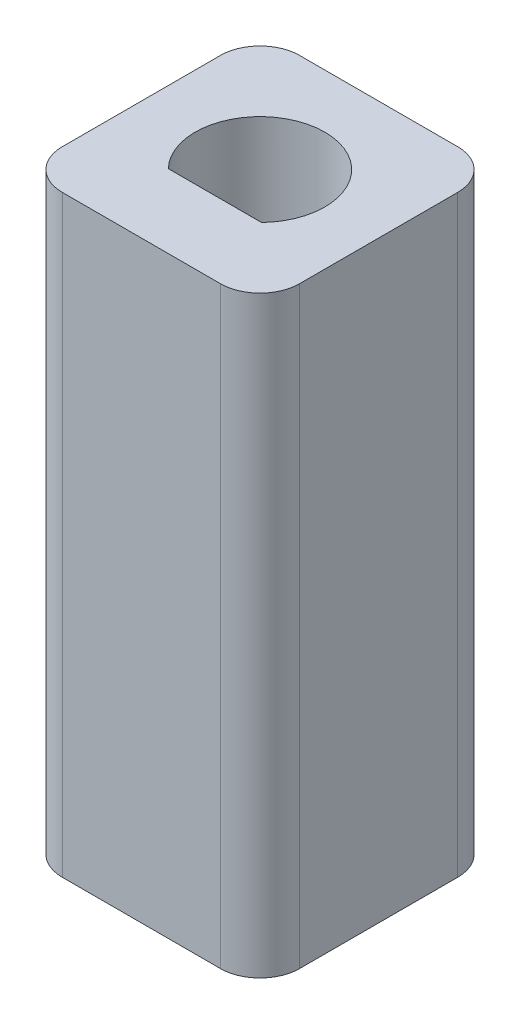
ISO-10303-21;
HEADER;
FILE_DESCRIPTION(('STEP AP214'),'2;1');
FILE_NAME('part.step','',(''),(''),'','','');
FILE_SCHEMA(('AUTOMOTIVE_DESIGN { 1 0 10303 214 1 1 1 1 }'));
ENDSEC;
DATA;
#1=APPLICATION_CONTEXT('core data for automotive mechanical design processes');
#2=APPLICATION_PROTOCOL_DEFINITION('international standard','automotive_design',2000,#1);
#3=PRODUCT_CONTEXT('',#1,'mechanical');
#4=PRODUCT('Part','Part','',(#3));
#5=PRODUCT_RELATED_PRODUCT_CATEGORY('part','',(#4));
#6=PRODUCT_DEFINITION_FORMATION('','',#4);
#7=PRODUCT_DEFINITION_CONTEXT('part definition',#1,'design');
#8=PRODUCT_DEFINITION('design','',#6,#7);
#9=PRODUCT_DEFINITION_SHAPE('','',#8);
#10=(LENGTH_UNIT() NAMED_UNIT(*) SI_UNIT(.MILLI.,.METRE.));
#11=(NAMED_UNIT(*) PLANE_ANGLE_UNIT() SI_UNIT($,.RADIAN.));
#12=(NAMED_UNIT(*) SI_UNIT($,.STERADIAN.) SOLID_ANGLE_UNIT());
#13=UNCERTAINTY_MEASURE_WITH_UNIT(LENGTH_MEASURE(1.E-05),#10,'distance_accuracy_value','');
#14=(GEOMETRIC_REPRESENTATION_CONTEXT(3) GLOBAL_UNCERTAINTY_ASSIGNED_CONTEXT((#13)) GLOBAL_UNIT_ASSIGNED_CONTEXT((#10,
#11,#12)) REPRESENTATION_CONTEXT('',''));
#15=CARTESIAN_POINT('',(0.,0.,0.));
#16=DIRECTION('',(0.,0.,1.));
#17=DIRECTION('',(1.,0.,0.));
#18=AXIS2_PLACEMENT_3D('',#15,#16,#17);
#19=CARTESIAN_POINT('',(0.,0.,0.));
#20=DIRECTION('',(0.,1.,0.));
#21=DIRECTION('',(0.,0.,1.));
#22=AXIS2_PLACEMENT_3D('',#19,#20,#21);
#23=PLANE('',#22);
#24=DIRECTION('',(1.,0.,0.));
#25=VECTOR('',#24,1.);
#26=CARTESIAN_POINT('',(-1.17898261225517,0.,1.14));
#27=LINE('',#26,#25);
#28=CARTESIAN_POINT('',(-1.03129837751131,0.,1.14));
#29=VERTEX_POINT('',#28);
#30=CARTESIAN_POINT('',(1.03129837751131,0.,1.14));
#31=VERTEX_POINT('',#30);
#32=EDGE_CURVE('E400',#29,#31,#27,.T.);
#33=ORIENTED_EDGE('',*,*,#32,.T.);
#34=CARTESIAN_POINT('',(1.435,0.,1.435));
#35=DIRECTION('',(0.,1.,0.));
#36=DIRECTION('',(0.,0.,-1.));
#37=AXIS2_PLACEMENT_3D('',#34,#35,#36);
#38=CIRCLE('',#37,0.5);
#39=CARTESIAN_POINT('',(0.935000000000001,0.,1.435));
#40=VERTEX_POINT('',#39);
#41=EDGE_CURVE('E299',#31,#40,#38,.T.);
#42=ORIENTED_EDGE('',*,*,#41,.T.);
#43=DIRECTION('',(0.,0.,1.));
#44=VECTOR('',#43,1.);
#45=CARTESIAN_POINT('',(0.935000000000001,0.,1.435));
#46=LINE('',#45,#44);
#47=CARTESIAN_POINT('',(0.935000000000001,0.,2.35));
#48=VERTEX_POINT('',#47);
#49=EDGE_CURVE('E257',#40,#48,#46,.T.);
#50=ORIENTED_EDGE('',*,*,#49,.T.);
#51=CARTESIAN_POINT('',(0.,0.,0.));
#52=DIRECTION('',(0.,-1.,0.));
#53=DIRECTION('',(0.,0.,-1.));
#54=AXIS2_PLACEMENT_3D('',#51,#52,#53);
#55=CIRCLE('',#54,2.52917476659878);
#56=CARTESIAN_POINT('',(-0.934999999999999,0.,2.35));
#57=VERTEX_POINT('',#56);
#58=EDGE_CURVE('E301',#48,#57,#55,.T.);
#59=ORIENTED_EDGE('',*,*,#58,.T.);
#60=DIRECTION('',(0.,0.,-1.));
#61=VECTOR('',#60,1.);
#62=CARTESIAN_POINT('',(-0.935,0.,2.35));
#63=LINE('',#62,#61);
#64=CARTESIAN_POINT('',(-0.935,0.,1.435));
#65=VERTEX_POINT('',#64);
#66=EDGE_CURVE('E304',#57,#65,#63,.T.);
#67=ORIENTED_EDGE('',*,*,#66,.T.);
#68=CARTESIAN_POINT('',(-1.435,0.,1.435));
#69=DIRECTION('',(0.,1.,0.));
#70=DIRECTION('',(0.,0.,-1.));
#71=AXIS2_PLACEMENT_3D('',#68,#69,#70);
#72=CIRCLE('',#71,0.5);
#73=EDGE_CURVE('E308',#65,#29,#72,.T.);
#74=ORIENTED_EDGE('',*,*,#73,.T.);
#75=EDGE_LOOP('',(#33,#42,#50,#59,#67,#74));
#76=FACE_BOUND('',#75,.T.);
#77=ADVANCED_FACE('F41',(#76),#23,.F.);
#78=CARTESIAN_POINT('',(0.,0.,0.));
#79=DIRECTION('',(0.,1.,0.));
#80=DIRECTION('',(0.,0.,1.));
#81=AXIS2_PLACEMENT_3D('',#78,#79,#80);
#82=CIRCLE('',#81,1.64000000000002);
#83=CARTESIAN_POINT('',(-1.34114758379907,0.,-0.943887259406512));
#84=VERTEX_POINT('',#83);
#85=CARTESIAN_POINT('',(-1.34114758379907,0.,0.943887259406512));
#86=VERTEX_POINT('',#85);
#87=EDGE_CURVE('E517',#84,#86,#82,.T.);
#88=ORIENTED_EDGE('',*,*,#87,.T.);
#89=CARTESIAN_POINT('',(-1.435,0.,0.935));
#90=VERTEX_POINT('',#89);
#91=EDGE_CURVE('E312',#86,#90,#72,.T.);
#92=ORIENTED_EDGE('',*,*,#91,.T.);
#93=DIRECTION('',(-1.,0.,0.));
#94=VECTOR('',#93,1.);
#95=CARTESIAN_POINT('',(-1.435,0.,0.935));
#96=LINE('',#95,#94);
#97=CARTESIAN_POINT('',(-2.35,0.,0.934999999999999));
#98=VERTEX_POINT('',#97);
#99=EDGE_CURVE('E311',#90,#98,#96,.T.);
#100=ORIENTED_EDGE('',*,*,#99,.T.);
#101=CARTESIAN_POINT('',(0.,0.,0.));
#102=DIRECTION('',(0.,-1.,0.));
#103=DIRECTION('',(0.,0.,-1.));
#104=AXIS2_PLACEMENT_3D('',#101,#102,#103);
#105=CIRCLE('',#104,2.52917476659878);
#106=CARTESIAN_POINT('',(-2.35,0.,-0.935));
#107=VERTEX_POINT('',#106);
#108=EDGE_CURVE('E315',#98,#107,#105,.T.);
#109=ORIENTED_EDGE('',*,*,#108,.T.);
#110=DIRECTION('',(1.,0.,0.));
#111=VECTOR('',#110,1.);
#112=CARTESIAN_POINT('',(-2.35,0.,-0.935));
#113=LINE('',#112,#111);
#114=CARTESIAN_POINT('',(-1.435,0.,-0.935));
#115=VERTEX_POINT('',#114);
#116=EDGE_CURVE('E318',#107,#115,#113,.T.);
#117=ORIENTED_EDGE('',*,*,#116,.T.);
#118=CARTESIAN_POINT('',(-1.435,0.,-1.435));
#119=DIRECTION('',(0.,1.,0.));
#120=DIRECTION('',(0.,0.,-1.));
#121=AXIS2_PLACEMENT_3D('',#118,#119,#120);
#122=CIRCLE('',#121,0.5);
#123=EDGE_CURVE('E322',#115,#84,#122,.T.);
#124=ORIENTED_EDGE('',*,*,#123,.T.);
#125=EDGE_LOOP('',(#88,#92,#100,#109,#117,#124));
#126=FACE_BOUND('',#125,.T.);
#127=ADVANCED_FACE('F483',(#126),#23,.F.);
#128=CARTESIAN_POINT('',(0.943887259406503,0.,-1.34114758379912));
#129=VERTEX_POINT('',#128);
#130=CARTESIAN_POINT('',(-0.943887259406511,0.,-1.34114758379908));
#131=VERTEX_POINT('',#130);
#132=EDGE_CURVE('E510',#129,#131,#82,.T.);
#133=ORIENTED_EDGE('',*,*,#132,.T.);
#134=CARTESIAN_POINT('',(-0.935000000000001,0.,-1.435));
#135=VERTEX_POINT('',#134);
#136=EDGE_CURVE('E326',#131,#135,#122,.T.);
#137=ORIENTED_EDGE('',*,*,#136,.T.);
#138=DIRECTION('',(0.,0.,-1.));
#139=VECTOR('',#138,1.);
#140=CARTESIAN_POINT('',(-0.935000000000001,0.,-1.435));
#141=LINE('',#140,#139);
#142=CARTESIAN_POINT('',(-0.935,0.,-2.35));
#143=VERTEX_POINT('',#142);
#144=EDGE_CURVE('E325',#135,#143,#141,.T.);
#145=ORIENTED_EDGE('',*,*,#144,.T.);
#146=CARTESIAN_POINT('',(0.,0.,0.));
#147=DIRECTION('',(0.,-1.,0.));
#148=DIRECTION('',(0.,0.,-1.));
#149=AXIS2_PLACEMENT_3D('',#146,#147,#148);
#150=CIRCLE('',#149,2.52917476659878);
#151=CARTESIAN_POINT('',(0.935000000000001,0.,-2.35));
#152=VERTEX_POINT('',#151);
#153=EDGE_CURVE('E329',#143,#152,#150,.T.);
#154=ORIENTED_EDGE('',*,*,#153,.T.);
#155=DIRECTION('',(0.,0.,1.));
#156=VECTOR('',#155,1.);
#157=CARTESIAN_POINT('',(0.935000000000001,0.,-2.35));
#158=LINE('',#157,#156);
#159=CARTESIAN_POINT('',(0.935000000000001,0.,-1.435));
#160=VERTEX_POINT('',#159);
#161=EDGE_CURVE('E332',#152,#160,#158,.T.);
#162=ORIENTED_EDGE('',*,*,#161,.T.);
#163=CARTESIAN_POINT('',(1.435,0.,-1.435));
#164=DIRECTION('',(0.,1.,0.));
#165=DIRECTION('',(0.,0.,-1.));
#166=AXIS2_PLACEMENT_3D('',#163,#164,#165);
#167=CIRCLE('',#166,0.5);
#168=EDGE_CURVE('E336',#160,#129,#167,.T.);
#169=ORIENTED_EDGE('',*,*,#168,.T.);
#170=EDGE_LOOP('',(#133,#137,#145,#154,#162,#169));
#171=FACE_BOUND('',#170,.T.);
#172=ADVANCED_FACE('F490',(#171),#23,.F.);
#173=CARTESIAN_POINT('',(0.,8.,0.));
#174=DIRECTION('',(0.,1.,0.));
#175=DIRECTION('',(0.,0.,1.));
#176=AXIS2_PLACEMENT_3D('',#173,#174,#175);
#177=PLANE('',#176);
#178=DIRECTION('',(1.,0.,0.));
#179=VECTOR('',#178,1.);
#180=CARTESIAN_POINT('',(-3.,8.,3.));
#181=LINE('',#180,#179);
#182=CARTESIAN_POINT('',(-2.,8.,3.));
#183=VERTEX_POINT('',#182);
#184=CARTESIAN_POINT('',(2.,8.,3.));
#185=VERTEX_POINT('',#184);
#186=EDGE_CURVE('E413',#183,#185,#181,.T.);
#187=ORIENTED_EDGE('',*,*,#186,.T.);
#188=CARTESIAN_POINT('',(2.,8.,2.));
#189=DIRECTION('',(0.,1.,0.));
#190=DIRECTION('',(0.,0.,1.));
#191=AXIS2_PLACEMENT_3D('',#188,#189,#190);
#192=CIRCLE('',#191,1.);
#193=CARTESIAN_POINT('',(3.,8.,2.));
#194=VERTEX_POINT('',#193);
#195=EDGE_CURVE('E439',#185,#194,#192,.T.);
#196=ORIENTED_EDGE('',*,*,#195,.T.);
#197=DIRECTION('',(0.,0.,-1.));
#198=VECTOR('',#197,1.);
#199=CARTESIAN_POINT('',(3.,8.,-3.));
#200=LINE('',#199,#198);
#201=CARTESIAN_POINT('',(3.,8.,-2.));
#202=VERTEX_POINT('',#201);
#203=EDGE_CURVE('E406',#194,#202,#200,.T.);
#204=ORIENTED_EDGE('',*,*,#203,.T.);
#205=CARTESIAN_POINT('',(2.,8.,-2.));
#206=DIRECTION('',(0.,1.,0.));
#207=DIRECTION('',(0.,0.,1.));
#208=AXIS2_PLACEMENT_3D('',#205,#206,#207);
#209=CIRCLE('',#208,1.);
#210=CARTESIAN_POINT('',(2.,8.,-3.));
#211=VERTEX_POINT('',#210);
#212=EDGE_CURVE('E434',#202,#211,#209,.T.);
#213=ORIENTED_EDGE('',*,*,#212,.T.);
#214=DIRECTION('',(-1.,0.,0.));
#215=VECTOR('',#214,1.);
#216=CARTESIAN_POINT('',(-3.,8.,-3.));
#217=LINE('',#216,#215);
#218=CARTESIAN_POINT('',(-2.,8.,-3.));
#219=VERTEX_POINT('',#218);
#220=EDGE_CURVE('E409',#211,#219,#217,.T.);
#221=ORIENTED_EDGE('',*,*,#220,.T.);
#222=CARTESIAN_POINT('',(-2.,8.,-2.));
#223=DIRECTION('',(0.,1.,0.));
#224=DIRECTION('',(0.,0.,1.));
#225=AXIS2_PLACEMENT_3D('',#222,#223,#224);
#226=CIRCLE('',#225,1.);
#227=CARTESIAN_POINT('',(-3.,8.,-2.));
#228=VERTEX_POINT('',#227);
#229=EDGE_CURVE('E63',#219,#228,#226,.T.);
#230=ORIENTED_EDGE('',*,*,#229,.T.);
#231=DIRECTION('',(0.,0.,1.));
#232=VECTOR('',#231,1.);
#233=CARTESIAN_POINT('',(-3.,8.,-3.));
#234=LINE('',#233,#232);
#235=CARTESIAN_POINT('',(-3.,8.,2.));
#236=VERTEX_POINT('',#235);
#237=EDGE_CURVE('E411',#228,#236,#234,.T.);
#238=ORIENTED_EDGE('',*,*,#237,.T.);
#239=CARTESIAN_POINT('',(-2.,8.,2.));
#240=DIRECTION('',(0.,1.,0.));
#241=DIRECTION('',(0.,0.,1.));
#242=AXIS2_PLACEMENT_3D('',#239,#240,#241);
#243=CIRCLE('',#242,1.);
#244=EDGE_CURVE('E437',#236,#183,#243,.T.);
#245=ORIENTED_EDGE('',*,*,#244,.T.);
#246=EDGE_LOOP('',(#187,#196,#204,#213,#221,#230,#238,#245));
#247=FACE_BOUND('',#246,.T.);
#248=DIRECTION('',(1.,0.,0.));
#249=VECTOR('',#248,1.);
#250=CARTESIAN_POINT('',(-1.17898261225517,8.,1.14));
#251=LINE('',#250,#249);
#252=CARTESIAN_POINT('',(-1.17898261225517,8.,1.14));
#253=VERTEX_POINT('',#252);
#254=CARTESIAN_POINT('',(1.17898261225522,8.,1.14));
#255=VERTEX_POINT('',#254);
#256=EDGE_CURVE('E391',#253,#255,#251,.T.);
#257=ORIENTED_EDGE('',*,*,#256,.F.);
#258=CARTESIAN_POINT('',(0.,8.,0.));
#259=DIRECTION('',(0.,1.,0.));
#260=DIRECTION('',(0.,0.,1.));
#261=AXIS2_PLACEMENT_3D('',#258,#259,#260);
#262=CIRCLE('',#261,1.64000000000002);
#263=EDGE_CURVE('E388',#255,#253,#262,.T.);
#264=ORIENTED_EDGE('',*,*,#263,.F.);
#265=EDGE_LOOP('',(#257,#264));
#266=FACE_BOUND('',#265,.T.);
#267=ADVANCED_FACE('F460',(#247,#266),#177,.T.);
#268=DIRECTION('',(-1.,0.,0.));
#269=VECTOR('',#268,1.);
#270=CARTESIAN_POINT('',(2.35,0.,0.935));
#271=LINE('',#270,#269);
#272=CARTESIAN_POINT('',(2.35,0.,0.935));
#273=VERTEX_POINT('',#272);
#274=CARTESIAN_POINT('',(1.435,0.,0.935));
#275=VERTEX_POINT('',#274);
#276=EDGE_CURVE('E251',#273,#275,#271,.T.);
#277=ORIENTED_EDGE('',*,*,#276,.T.);
#278=CARTESIAN_POINT('',(1.34114758379912,0.,0.943887259406501));
#279=VERTEX_POINT('',#278);
#280=EDGE_CURVE('E295',#275,#279,#38,.T.);
#281=ORIENTED_EDGE('',*,*,#280,.T.);
#282=CARTESIAN_POINT('',(1.34114758379912,0.,-0.943887259406501));
#283=VERTEX_POINT('',#282);
#284=EDGE_CURVE('E398',#279,#283,#82,.T.);
#285=ORIENTED_EDGE('',*,*,#284,.T.);
#286=CARTESIAN_POINT('',(1.435,0.,-0.935));
#287=VERTEX_POINT('',#286);
#288=EDGE_CURVE('E340',#283,#287,#167,.T.);
#289=ORIENTED_EDGE('',*,*,#288,.T.);
#290=DIRECTION('',(1.,0.,0.));
#291=VECTOR('',#290,1.);
#292=CARTESIAN_POINT('',(1.435,0.,-0.935));
#293=LINE('',#292,#291);
#294=CARTESIAN_POINT('',(2.35,0.,-0.935000000000001));
#295=VERTEX_POINT('',#294);
#296=EDGE_CURVE('E339',#287,#295,#293,.T.);
#297=ORIENTED_EDGE('',*,*,#296,.T.);
#298=CARTESIAN_POINT('',(0.,0.,0.));
#299=DIRECTION('',(0.,-1.,0.));
#300=DIRECTION('',(0.,0.,-1.));
#301=AXIS2_PLACEMENT_3D('',#298,#299,#300);
#302=CIRCLE('',#301,2.52917476659878);
#303=EDGE_CURVE('E343',#295,#273,#302,.T.);
#304=ORIENTED_EDGE('',*,*,#303,.T.);
#305=EDGE_LOOP('',(#277,#281,#285,#289,#297,#304));
#306=FACE_BOUND('',#305,.T.);
#307=ADVANCED_FACE('F486',(#306),#23,.F.);
#308=CARTESIAN_POINT('',(3.,8.,-3.));
#309=DIRECTION('',(-1.,0.,0.));
#310=DIRECTION('',(0.,0.,1.));
#311=AXIS2_PLACEMENT_3D('',#308,#309,#310);
#312=PLANE('',#311);
#313=ORIENTED_EDGE('',*,*,#203,.F.);
#314=DIRECTION('',(0.,-1.,0.));
#315=VECTOR('',#314,1.);
#316=CARTESIAN_POINT('',(3.,8.,2.));
#317=LINE('',#316,#315);
#318=CARTESIAN_POINT('',(3.,-7.,2.));
#319=VERTEX_POINT('',#318);
#320=EDGE_CURVE('E418',#194,#319,#317,.T.);
#321=ORIENTED_EDGE('',*,*,#320,.T.);
#322=DIRECTION('',(0.,0.,1.));
#323=VECTOR('',#322,1.);
#324=CARTESIAN_POINT('',(3.,-7.,-3.));
#325=LINE('',#324,#323);
#326=CARTESIAN_POINT('',(3.,-7.,-2.));
#327=VERTEX_POINT('',#326);
#328=EDGE_CURVE('E381',#327,#319,#325,.T.);
#329=ORIENTED_EDGE('',*,*,#328,.F.);
#330=DIRECTION('',(0.,-1.,0.));
#331=VECTOR('',#330,1.);
#332=CARTESIAN_POINT('',(3.,8.,-2.));
#333=LINE('',#332,#331);
#334=EDGE_CURVE('E416',#327,#202,#333,.F.);
#335=ORIENTED_EDGE('',*,*,#334,.T.);
#336=EDGE_LOOP('',(#313,#321,#329,#335));
#337=FACE_BOUND('',#336,.T.);
#338=ADVANCED_FACE('F476',(#337),#312,.F.);
#339=CARTESIAN_POINT('',(-3.,8.,-3.));
#340=DIRECTION('',(0.,0.,1.));
#341=DIRECTION('',(1.,0.,0.));
#342=AXIS2_PLACEMENT_3D('',#339,#340,#341);
#343=PLANE('',#342);
#344=DIRECTION('',(1.,0.,0.));
#345=VECTOR('',#344,1.);
#346=CARTESIAN_POINT('',(3.,-7.,-3.));
#347=LINE('',#346,#345);
#348=CARTESIAN_POINT('',(-2.,-7.,-3.));
#349=VERTEX_POINT('',#348);
#350=CARTESIAN_POINT('',(2.,-7.,-3.));
#351=VERTEX_POINT('',#350);
#352=EDGE_CURVE('E378',#349,#351,#347,.T.);
#353=ORIENTED_EDGE('',*,*,#352,.F.);
#354=DIRECTION('',(0.,-1.,0.));
#355=VECTOR('',#354,1.);
#356=CARTESIAN_POINT('',(-2.,8.,-3.));
#357=LINE('',#356,#355);
#358=EDGE_CURVE('E11',#349,#219,#357,.F.);
#359=ORIENTED_EDGE('',*,*,#358,.T.);
#360=ORIENTED_EDGE('',*,*,#220,.F.);
#361=DIRECTION('',(0.,-1.,0.));
#362=VECTOR('',#361,1.);
#363=CARTESIAN_POINT('',(2.,8.,-3.));
#364=LINE('',#363,#362);
#365=EDGE_CURVE('E49',#211,#351,#364,.T.);
#366=ORIENTED_EDGE('',*,*,#365,.T.);
#367=EDGE_LOOP('',(#353,#359,#360,#366));
#368=FACE_BOUND('',#367,.T.);
#369=ADVANCED_FACE('F449',(#368),#343,.F.);
#370=CARTESIAN_POINT('',(-3.,8.,-3.));
#371=DIRECTION('',(1.,0.,0.));
#372=DIRECTION('',(0.,0.,-1.));
#373=AXIS2_PLACEMENT_3D('',#370,#371,#372);
#374=PLANE('',#373);
#375=DIRECTION('',(0.,0.,-1.));
#376=VECTOR('',#375,1.);
#377=CARTESIAN_POINT('',(-3.,-7.,-3.));
#378=LINE('',#377,#376);
#379=CARTESIAN_POINT('',(-3.,-7.,2.));
#380=VERTEX_POINT('',#379);
#381=CARTESIAN_POINT('',(-3.,-7.,-2.));
#382=VERTEX_POINT('',#381);
#383=EDGE_CURVE('E258',#380,#382,#378,.T.);
#384=ORIENTED_EDGE('',*,*,#383,.F.);
#385=DIRECTION('',(0.,-1.,0.));
#386=VECTOR('',#385,1.);
#387=CARTESIAN_POINT('',(-3.,8.,2.));
#388=LINE('',#387,#386);
#389=EDGE_CURVE('E56',#380,#236,#388,.F.);
#390=ORIENTED_EDGE('',*,*,#389,.T.);
#391=ORIENTED_EDGE('',*,*,#237,.F.);
#392=DIRECTION('',(0.,-1.,0.));
#393=VECTOR('',#392,1.);
#394=CARTESIAN_POINT('',(-3.,8.,-2.));
#395=LINE('',#394,#393);
#396=EDGE_CURVE('E441',#228,#382,#395,.T.);
#397=ORIENTED_EDGE('',*,*,#396,.T.);
#398=EDGE_LOOP('',(#384,#390,#391,#397));
#399=FACE_BOUND('',#398,.T.);
#400=ADVANCED_FACE('F458',(#399),#374,.F.);
#401=CARTESIAN_POINT('',(-3.,8.,3.));
#402=DIRECTION('',(0.,0.,-1.));
#403=DIRECTION('',(-1.,0.,0.));
#404=AXIS2_PLACEMENT_3D('',#401,#402,#403);
#405=PLANE('',#404);
#406=DIRECTION('',(-1.,0.,0.));
#407=VECTOR('',#406,1.);
#408=CARTESIAN_POINT('',(3.,-7.,3.));
#409=LINE('',#408,#407);
#410=CARTESIAN_POINT('',(2.,-7.,3.));
#411=VERTEX_POINT('',#410);
#412=CARTESIAN_POINT('',(-2.,-7.,3.));
#413=VERTEX_POINT('',#412);
#414=EDGE_CURVE('E384',#411,#413,#409,.T.);
#415=ORIENTED_EDGE('',*,*,#414,.F.);
#416=DIRECTION('',(0.,-1.,0.));
#417=VECTOR('',#416,1.);
#418=CARTESIAN_POINT('',(2.,8.,3.));
#419=LINE('',#418,#417);
#420=EDGE_CURVE('E432',#411,#185,#419,.F.);
#421=ORIENTED_EDGE('',*,*,#420,.T.);
#422=ORIENTED_EDGE('',*,*,#186,.F.);
#423=DIRECTION('',(0.,-1.,0.));
#424=VECTOR('',#423,1.);
#425=CARTESIAN_POINT('',(-2.,8.,3.));
#426=LINE('',#425,#424);
#427=EDGE_CURVE('E429',#183,#413,#426,.T.);
#428=ORIENTED_EDGE('',*,*,#427,.T.);
#429=EDGE_LOOP('',(#415,#421,#422,#428));
#430=FACE_BOUND('',#429,.T.);
#431=ADVANCED_FACE('F468',(#430),#405,.F.);
#432=CARTESIAN_POINT('',(0.,8.,0.));
#433=DIRECTION('',(0.,-1.,0.));
#434=DIRECTION('',(0.,0.,-1.));
#435=AXIS2_PLACEMENT_3D('',#432,#433,#434);
#436=CYLINDRICAL_SURFACE('',#435,1.64000000000002);
#437=CARTESIAN_POINT('',(1.17898261225522,0.,1.14));
#438=VERTEX_POINT('',#437);
#439=EDGE_CURVE('E395',#438,#279,#82,.T.);
#440=ORIENTED_EDGE('',*,*,#439,.F.);
#441=DIRECTION('',(0.,-1.,0.));
#442=VECTOR('',#441,1.);
#443=CARTESIAN_POINT('',(1.17898261225522,8.,1.14));
#444=LINE('',#443,#442);
#445=EDGE_CURVE('E394',#255,#438,#444,.T.);
#446=ORIENTED_EDGE('',*,*,#445,.F.);
#447=ORIENTED_EDGE('',*,*,#263,.T.);
#448=DIRECTION('',(0.,-1.,0.));
#449=VECTOR('',#448,1.);
#450=CARTESIAN_POINT('',(-1.17898261225517,8.,1.14));
#451=LINE('',#450,#449);
#452=CARTESIAN_POINT('',(-1.17898261225517,0.,1.14));
#453=VERTEX_POINT('',#452);
#454=EDGE_CURVE('E403',#253,#453,#451,.T.);
#455=ORIENTED_EDGE('',*,*,#454,.T.);
#456=EDGE_CURVE('E387',#86,#453,#82,.T.);
#457=ORIENTED_EDGE('',*,*,#456,.F.);
#458=ORIENTED_EDGE('',*,*,#87,.F.);
#459=EDGE_CURVE('E516',#131,#84,#82,.T.);
#460=ORIENTED_EDGE('',*,*,#459,.F.);
#461=ORIENTED_EDGE('',*,*,#132,.F.);
#462=EDGE_CURVE('E515',#283,#129,#82,.T.);
#463=ORIENTED_EDGE('',*,*,#462,.F.);
#464=ORIENTED_EDGE('',*,*,#284,.F.);
#465=EDGE_LOOP('',(#440,#446,#447,#455,#457,#458,#460,#461,#463,#464));
#466=FACE_BOUND('',#465,.T.);
#467=ADVANCED_FACE('F535',(#466),#436,.F.);
#468=CARTESIAN_POINT('',(-1.17898261225517,8.,1.14));
#469=DIRECTION('',(0.,0.,-1.));
#470=DIRECTION('',(-1.,0.,0.));
#471=AXIS2_PLACEMENT_3D('',#468,#469,#470);
#472=PLANE('',#471);
#473=EDGE_CURVE('E392',#453,#29,#27,.T.);
#474=ORIENTED_EDGE('',*,*,#473,.F.);
#475=ORIENTED_EDGE('',*,*,#454,.F.);
#476=ORIENTED_EDGE('',*,*,#256,.T.);
#477=ORIENTED_EDGE('',*,*,#445,.T.);
#478=EDGE_CURVE('E397',#31,#438,#27,.T.);
#479=ORIENTED_EDGE('',*,*,#478,.F.);
#480=ORIENTED_EDGE('',*,*,#32,.F.);
#481=EDGE_LOOP('',(#474,#475,#476,#477,#479,#480));
#482=FACE_BOUND('',#481,.T.);
#483=ADVANCED_FACE('F532',(#482),#472,.T.);
#484=CARTESIAN_POINT('',(0.,0.,0.));
#485=DIRECTION('',(0.,-1.,0.));
#486=DIRECTION('',(0.,0.,-1.));
#487=AXIS2_PLACEMENT_3D('',#484,#485,#486);
#488=PLANE('',#487);
#489=EDGE_CURVE('E335',#129,#283,#167,.T.);
#490=ORIENTED_EDGE('',*,*,#489,.T.);
#491=ORIENTED_EDGE('',*,*,#462,.T.);
#492=EDGE_LOOP('',(#490,#491));
#493=FACE_BOUND('',#492,.T.);
#494=ADVANCED_FACE('F583',(#493),#488,.F.);
#495=EDGE_CURVE('E321',#84,#131,#122,.T.);
#496=ORIENTED_EDGE('',*,*,#495,.T.);
#497=ORIENTED_EDGE('',*,*,#459,.T.);
#498=EDGE_LOOP('',(#496,#497));
#499=FACE_BOUND('',#498,.T.);
#500=ADVANCED_FACE('F548',(#499),#488,.F.);
#501=EDGE_CURVE('E307',#29,#86,#72,.T.);
#502=ORIENTED_EDGE('',*,*,#501,.T.);
#503=ORIENTED_EDGE('',*,*,#456,.T.);
#504=ORIENTED_EDGE('',*,*,#473,.T.);
#505=EDGE_LOOP('',(#502,#503,#504));
#506=FACE_BOUND('',#505,.T.);
#507=ADVANCED_FACE('F528',(#506),#488,.F.);
#508=ORIENTED_EDGE('',*,*,#478,.T.);
#509=ORIENTED_EDGE('',*,*,#439,.T.);
#510=EDGE_CURVE('E298',#279,#31,#38,.T.);
#511=ORIENTED_EDGE('',*,*,#510,.T.);
#512=EDGE_LOOP('',(#508,#509,#511));
#513=FACE_BOUND('',#512,.T.);
#514=ADVANCED_FACE('F588',(#513),#488,.F.);
#515=CARTESIAN_POINT('',(0.,-7.,0.));
#516=DIRECTION('',(0.,-1.,0.));
#517=DIRECTION('',(0.,0.,-1.));
#518=AXIS2_PLACEMENT_3D('',#515,#516,#517);
#519=PLANE('',#518);
#520=ORIENTED_EDGE('',*,*,#328,.T.);
#521=CARTESIAN_POINT('',(2.,-7.,2.));
#522=DIRECTION('',(0.,-1.,0.));
#523=DIRECTION('',(0.,0.,-1.));
#524=AXIS2_PLACEMENT_3D('',#521,#522,#523);
#525=CIRCLE('',#524,1.);
#526=EDGE_CURVE('E427',#319,#411,#525,.T.);
#527=ORIENTED_EDGE('',*,*,#526,.T.);
#528=ORIENTED_EDGE('',*,*,#414,.T.);
#529=CARTESIAN_POINT('',(-2.,-7.,2.));
#530=DIRECTION('',(0.,-1.,0.));
#531=DIRECTION('',(0.,0.,-1.));
#532=AXIS2_PLACEMENT_3D('',#529,#530,#531);
#533=CIRCLE('',#532,1.);
#534=EDGE_CURVE('E425',#413,#380,#533,.T.);
#535=ORIENTED_EDGE('',*,*,#534,.T.);
#536=ORIENTED_EDGE('',*,*,#383,.T.);
#537=CARTESIAN_POINT('',(-2.,-7.,-2.));
#538=DIRECTION('',(0.,-1.,0.));
#539=DIRECTION('',(0.,0.,-1.));
#540=AXIS2_PLACEMENT_3D('',#537,#538,#539);
#541=CIRCLE('',#540,1.);
#542=EDGE_CURVE('E423',#382,#349,#541,.T.);
#543=ORIENTED_EDGE('',*,*,#542,.T.);
#544=ORIENTED_EDGE('',*,*,#352,.T.);
#545=CARTESIAN_POINT('',(2.,-7.,-2.));
#546=DIRECTION('',(0.,-1.,0.));
#547=DIRECTION('',(0.,0.,-1.));
#548=AXIS2_PLACEMENT_3D('',#545,#546,#547);
#549=CIRCLE('',#548,1.);
#550=EDGE_CURVE('E421',#351,#327,#549,.T.);
#551=ORIENTED_EDGE('',*,*,#550,.T.);
#552=EDGE_LOOP('',(#520,#527,#528,#535,#536,#543,#544,#551));
#553=FACE_BOUND('',#552,.T.);
#554=DIRECTION('',(0.,0.,1.));
#555=VECTOR('',#554,1.);
#556=CARTESIAN_POINT('',(0.935000000000001,-7.,1.435));
#557=LINE('',#556,#555);
#558=CARTESIAN_POINT('',(0.935000000000001,-7.,1.435));
#559=VERTEX_POINT('',#558);
#560=CARTESIAN_POINT('',(0.935000000000001,-7.,2.35));
#561=VERTEX_POINT('',#560);
#562=EDGE_CURVE('E250',#559,#561,#557,.T.);
#563=ORIENTED_EDGE('',*,*,#562,.F.);
#564=CARTESIAN_POINT('',(1.435,-7.,1.435));
#565=DIRECTION('',(0.,1.,0.));
#566=DIRECTION('',(0.,0.,-1.));
#567=AXIS2_PLACEMENT_3D('',#564,#565,#566);
#568=CIRCLE('',#567,0.5);
#569=CARTESIAN_POINT('',(1.435,-7.,0.934999999999999));
#570=VERTEX_POINT('',#569);
#571=EDGE_CURVE('E240',#570,#559,#568,.T.);
#572=ORIENTED_EDGE('',*,*,#571,.F.);
#573=DIRECTION('',(-1.,0.,0.));
#574=VECTOR('',#573,1.);
#575=CARTESIAN_POINT('',(2.35,-7.,0.935));
#576=LINE('',#575,#574);
#577=CARTESIAN_POINT('',(2.35,-7.,0.935));
#578=VERTEX_POINT('',#577);
#579=EDGE_CURVE('E293',#578,#570,#576,.T.);
#580=ORIENTED_EDGE('',*,*,#579,.F.);
#581=CARTESIAN_POINT('',(0.,-7.,0.));
#582=DIRECTION('',(0.,-1.,0.));
#583=DIRECTION('',(0.,0.,-1.));
#584=AXIS2_PLACEMENT_3D('',#581,#582,#583);
#585=CIRCLE('',#584,2.52917476659878);
#586=CARTESIAN_POINT('',(2.35,-7.,-0.935000000000002));
#587=VERTEX_POINT('',#586);
#588=EDGE_CURVE('E290',#587,#578,#585,.T.);
#589=ORIENTED_EDGE('',*,*,#588,.F.);
#590=DIRECTION('',(1.,0.,0.));
#591=VECTOR('',#590,1.);
#592=CARTESIAN_POINT('',(1.435,-7.,-0.935));
#593=LINE('',#592,#591);
#594=CARTESIAN_POINT('',(1.435,-7.,-0.935));
#595=VERTEX_POINT('',#594);
#596=EDGE_CURVE('E288',#595,#587,#593,.T.);
#597=ORIENTED_EDGE('',*,*,#596,.F.);
#598=CARTESIAN_POINT('',(1.435,-7.,-1.435));
#599=DIRECTION('',(0.,1.,0.));
#600=DIRECTION('',(0.,0.,-1.));
#601=AXIS2_PLACEMENT_3D('',#598,#599,#600);
#602=CIRCLE('',#601,0.5);
#603=CARTESIAN_POINT('',(0.935000000000001,-7.,-1.435));
#604=VERTEX_POINT('',#603);
#605=EDGE_CURVE('E286',#604,#595,#602,.T.);
#606=ORIENTED_EDGE('',*,*,#605,.F.);
#607=DIRECTION('',(0.,0.,1.));
#608=VECTOR('',#607,1.);
#609=CARTESIAN_POINT('',(0.935000000000001,-7.,-2.35));
#610=LINE('',#609,#608);
#611=CARTESIAN_POINT('',(0.935000000000001,-7.,-2.35));
#612=VERTEX_POINT('',#611);
#613=EDGE_CURVE('E284',#612,#604,#610,.T.);
#614=ORIENTED_EDGE('',*,*,#613,.F.);
#615=CARTESIAN_POINT('',(0.,-7.,0.));
#616=DIRECTION('',(0.,-1.,0.));
#617=DIRECTION('',(0.,0.,-1.));
#618=AXIS2_PLACEMENT_3D('',#615,#616,#617);
#619=CIRCLE('',#618,2.52917476659878);
#620=CARTESIAN_POINT('',(-0.935,-7.,-2.35));
#621=VERTEX_POINT('',#620);
#622=EDGE_CURVE('E282',#621,#612,#619,.T.);
#623=ORIENTED_EDGE('',*,*,#622,.F.);
#624=DIRECTION('',(0.,0.,-1.));
#625=VECTOR('',#624,1.);
#626=CARTESIAN_POINT('',(-0.935000000000001,-7.,-1.435));
#627=LINE('',#626,#625);
#628=CARTESIAN_POINT('',(-0.935000000000001,-7.,-1.435));
#629=VERTEX_POINT('',#628);
#630=EDGE_CURVE('E280',#629,#621,#627,.T.);
#631=ORIENTED_EDGE('',*,*,#630,.F.);
#632=CARTESIAN_POINT('',(-1.435,-7.,-1.435));
#633=DIRECTION('',(0.,1.,0.));
#634=DIRECTION('',(0.,0.,-1.));
#635=AXIS2_PLACEMENT_3D('',#632,#633,#634);
#636=CIRCLE('',#635,0.5);
#637=CARTESIAN_POINT('',(-1.435,-7.,-0.935));
#638=VERTEX_POINT('',#637);
#639=EDGE_CURVE('E278',#638,#629,#636,.T.);
#640=ORIENTED_EDGE('',*,*,#639,.F.);
#641=DIRECTION('',(1.,0.,0.));
#642=VECTOR('',#641,1.);
#643=CARTESIAN_POINT('',(-2.35,-7.,-0.935));
#644=LINE('',#643,#642);
#645=CARTESIAN_POINT('',(-2.35,-7.,-0.935000000000001));
#646=VERTEX_POINT('',#645);
#647=EDGE_CURVE('E276',#646,#638,#644,.T.);
#648=ORIENTED_EDGE('',*,*,#647,.F.);
#649=CARTESIAN_POINT('',(0.,-7.,0.));
#650=DIRECTION('',(0.,-1.,0.));
#651=DIRECTION('',(0.,0.,-1.));
#652=AXIS2_PLACEMENT_3D('',#649,#650,#651);
#653=CIRCLE('',#652,2.52917476659878);
#654=CARTESIAN_POINT('',(-2.35,-7.,0.934999999999999));
#655=VERTEX_POINT('',#654);
#656=EDGE_CURVE('E274',#655,#646,#653,.T.);
#657=ORIENTED_EDGE('',*,*,#656,.F.);
#658=DIRECTION('',(-1.,0.,0.));
#659=VECTOR('',#658,1.);
#660=CARTESIAN_POINT('',(-1.435,-7.,0.934999999999999));
#661=LINE('',#660,#659);
#662=CARTESIAN_POINT('',(-1.435,-7.,0.935));
#663=VERTEX_POINT('',#662);
#664=EDGE_CURVE('E272',#663,#655,#661,.T.);
#665=ORIENTED_EDGE('',*,*,#664,.F.);
#666=CARTESIAN_POINT('',(-1.435,-7.,1.435));
#667=DIRECTION('',(0.,1.,0.));
#668=DIRECTION('',(0.,0.,-1.));
#669=AXIS2_PLACEMENT_3D('',#666,#667,#668);
#670=CIRCLE('',#669,0.5);
#671=CARTESIAN_POINT('',(-0.935,-7.,1.435));
#672=VERTEX_POINT('',#671);
#673=EDGE_CURVE('E270',#672,#663,#670,.T.);
#674=ORIENTED_EDGE('',*,*,#673,.F.);
#675=DIRECTION('',(0.,0.,-1.));
#676=VECTOR('',#675,1.);
#677=CARTESIAN_POINT('',(-0.935,-7.,2.35));
#678=LINE('',#677,#676);
#679=CARTESIAN_POINT('',(-0.934999999999999,-7.,2.35));
#680=VERTEX_POINT('',#679);
#681=EDGE_CURVE('E266',#680,#672,#678,.T.);
#682=ORIENTED_EDGE('',*,*,#681,.F.);
#683=CARTESIAN_POINT('',(0.,-7.,0.));
#684=DIRECTION('',(0.,-1.,0.));
#685=DIRECTION('',(0.,0.,-1.));
#686=AXIS2_PLACEMENT_3D('',#683,#684,#685);
#687=CIRCLE('',#686,2.52917476659878);
#688=EDGE_CURVE('E264',#561,#680,#687,.T.);
#689=ORIENTED_EDGE('',*,*,#688,.F.);
#690=EDGE_LOOP('',(#563,#572,#580,#589,#597,#606,#614,#623,#631,#640,#648,#657,#665,#674,#682,#689));
#691=FACE_BOUND('',#690,.T.);
#692=ADVANCED_FACE('F262',(#553,#691),#519,.T.);
#693=CARTESIAN_POINT('',(1.435,-7.,1.435));
#694=DIRECTION('',(0.,1.,0.));
#695=DIRECTION('',(0.,0.,1.));
#696=AXIS2_PLACEMENT_3D('',#693,#694,#695);
#697=CYLINDRICAL_SURFACE('',#696,0.5);
#698=ORIENTED_EDGE('',*,*,#280,.F.);
#699=DIRECTION('',(0.,1.,0.));
#700=VECTOR('',#699,1.);
#701=CARTESIAN_POINT('',(1.435,-7.,0.934999999999999));
#702=LINE('',#701,#700);
#703=EDGE_CURVE('E246',#570,#275,#702,.T.);
#704=ORIENTED_EDGE('',*,*,#703,.F.);
#705=ORIENTED_EDGE('',*,*,#571,.T.);
#706=DIRECTION('',(0.,1.,0.));
#707=VECTOR('',#706,1.);
#708=CARTESIAN_POINT('',(0.935000000000001,-7.,1.435));
#709=LINE('',#708,#707);
#710=EDGE_CURVE('E244',#559,#40,#709,.T.);
#711=ORIENTED_EDGE('',*,*,#710,.T.);
#712=ORIENTED_EDGE('',*,*,#41,.F.);
#713=ORIENTED_EDGE('',*,*,#510,.F.);
#714=EDGE_LOOP('',(#698,#704,#705,#711,#712,#713));
#715=FACE_BOUND('',#714,.T.);
#716=ADVANCED_FACE('F243',(#715),#697,.T.);
#717=CARTESIAN_POINT('',(0.935000000000001,-7.,1.435));
#718=DIRECTION('',(-1.,0.,0.));
#719=DIRECTION('',(0.,0.,1.));
#720=AXIS2_PLACEMENT_3D('',#717,#718,#719);
#721=PLANE('',#720);
#722=ORIENTED_EDGE('',*,*,#49,.F.);
#723=ORIENTED_EDGE('',*,*,#710,.F.);
#724=ORIENTED_EDGE('',*,*,#562,.T.);
#725=DIRECTION('',(0.,1.,0.));
#726=VECTOR('',#725,1.);
#727=CARTESIAN_POINT('',(0.935000000000001,-7.,2.35));
#728=LINE('',#727,#726);
#729=EDGE_CURVE('E259',#561,#48,#728,.T.);
#730=ORIENTED_EDGE('',*,*,#729,.T.);
#731=EDGE_LOOP('',(#722,#723,#724,#730));
#732=FACE_BOUND('',#731,.T.);
#733=ADVANCED_FACE('F254',(#732),#721,.T.);
#734=CARTESIAN_POINT('',(0.,-7.,0.));
#735=DIRECTION('',(0.,1.,0.));
#736=DIRECTION('',(0.,0.,1.));
#737=AXIS2_PLACEMENT_3D('',#734,#735,#736);
#738=CYLINDRICAL_SURFACE('',#737,2.52917476659878);
#739=ORIENTED_EDGE('',*,*,#58,.F.);
#740=ORIENTED_EDGE('',*,*,#729,.F.);
#741=ORIENTED_EDGE('',*,*,#688,.T.);
#742=DIRECTION('',(0.,1.,0.));
#743=VECTOR('',#742,1.);
#744=CARTESIAN_POINT('',(-0.934999999999999,-7.,2.35));
#745=LINE('',#744,#743);
#746=EDGE_CURVE('E373',#680,#57,#745,.T.);
#747=ORIENTED_EDGE('',*,*,#746,.T.);
#748=EDGE_LOOP('',(#739,#740,#741,#747));
#749=FACE_BOUND('',#748,.T.);
#750=ADVANCED_FACE('F741',(#749),#738,.F.);
#751=CARTESIAN_POINT('',(-0.935,-7.,2.35));
#752=DIRECTION('',(1.,0.,0.));
#753=DIRECTION('',(0.,0.,-1.));
#754=AXIS2_PLACEMENT_3D('',#751,#752,#753);
#755=PLANE('',#754);
#756=ORIENTED_EDGE('',*,*,#66,.F.);
#757=ORIENTED_EDGE('',*,*,#746,.F.);
#758=ORIENTED_EDGE('',*,*,#681,.T.);
#759=DIRECTION('',(0.,1.,0.));
#760=VECTOR('',#759,1.);
#761=CARTESIAN_POINT('',(-0.935,-7.,1.435));
#762=LINE('',#761,#760);
#763=EDGE_CURVE('E371',#672,#65,#762,.T.);
#764=ORIENTED_EDGE('',*,*,#763,.T.);
#765=EDGE_LOOP('',(#756,#757,#758,#764));
#766=FACE_BOUND('',#765,.T.);
#767=ADVANCED_FACE('F733',(#766),#755,.T.);
#768=CARTESIAN_POINT('',(-1.435,-7.,1.435));
#769=DIRECTION('',(0.,1.,0.));
#770=DIRECTION('',(0.,0.,1.));
#771=AXIS2_PLACEMENT_3D('',#768,#769,#770);
#772=CYLINDRICAL_SURFACE('',#771,0.5);
#773=ORIENTED_EDGE('',*,*,#73,.F.);
#774=ORIENTED_EDGE('',*,*,#763,.F.);
#775=ORIENTED_EDGE('',*,*,#673,.T.);
#776=DIRECTION('',(0.,1.,0.));
#777=VECTOR('',#776,1.);
#778=CARTESIAN_POINT('',(-1.435,-7.,0.935));
#779=LINE('',#778,#777);
#780=EDGE_CURVE('E369',#663,#90,#779,.T.);
#781=ORIENTED_EDGE('',*,*,#780,.T.);
#782=ORIENTED_EDGE('',*,*,#91,.F.);
#783=ORIENTED_EDGE('',*,*,#501,.F.);
#784=EDGE_LOOP('',(#773,#774,#775,#781,#782,#783));
#785=FACE_BOUND('',#784,.T.);
#786=ADVANCED_FACE('F545',(#785),#772,.T.);
#787=CARTESIAN_POINT('',(-1.435,-7.,0.934999999999999));
#788=DIRECTION('',(0.,0.,-1.));
#789=DIRECTION('',(-1.,0.,0.));
#790=AXIS2_PLACEMENT_3D('',#787,#788,#789);
#791=PLANE('',#790);
#792=ORIENTED_EDGE('',*,*,#99,.F.);
#793=ORIENTED_EDGE('',*,*,#780,.F.);
#794=ORIENTED_EDGE('',*,*,#664,.T.);
#795=DIRECTION('',(0.,1.,0.));
#796=VECTOR('',#795,1.);
#797=CARTESIAN_POINT('',(-2.35,-7.,0.934999999999999));
#798=LINE('',#797,#796);
#799=EDGE_CURVE('E367',#655,#98,#798,.T.);
#800=ORIENTED_EDGE('',*,*,#799,.T.);
#801=EDGE_LOOP('',(#792,#793,#794,#800));
#802=FACE_BOUND('',#801,.T.);
#803=ADVANCED_FACE('F716',(#802),#791,.T.);
#804=CARTESIAN_POINT('',(0.,-7.,0.));
#805=DIRECTION('',(0.,1.,0.));
#806=DIRECTION('',(0.,0.,1.));
#807=AXIS2_PLACEMENT_3D('',#804,#805,#806);
#808=CYLINDRICAL_SURFACE('',#807,2.52917476659878);
#809=ORIENTED_EDGE('',*,*,#108,.F.);
#810=ORIENTED_EDGE('',*,*,#799,.F.);
#811=ORIENTED_EDGE('',*,*,#656,.T.);
#812=DIRECTION('',(0.,1.,0.));
#813=VECTOR('',#812,1.);
#814=CARTESIAN_POINT('',(-2.35,-7.,-0.935000000000001));
#815=LINE('',#814,#813);
#816=EDGE_CURVE('E365',#646,#107,#815,.T.);
#817=ORIENTED_EDGE('',*,*,#816,.T.);
#818=EDGE_LOOP('',(#809,#810,#811,#817));
#819=FACE_BOUND('',#818,.T.);
#820=ADVANCED_FACE('F708',(#819),#808,.F.);
#821=CARTESIAN_POINT('',(-2.35,-7.,-0.935));
#822=DIRECTION('',(0.,0.,1.));
#823=DIRECTION('',(0.,-1.,0.));
#824=AXIS2_PLACEMENT_3D('',#821,#822,#823);
#825=PLANE('',#824);
#826=ORIENTED_EDGE('',*,*,#116,.F.);
#827=ORIENTED_EDGE('',*,*,#816,.F.);
#828=ORIENTED_EDGE('',*,*,#647,.T.);
#829=DIRECTION('',(0.,1.,0.));
#830=VECTOR('',#829,1.);
#831=CARTESIAN_POINT('',(-1.435,-7.,-0.935));
#832=LINE('',#831,#830);
#833=EDGE_CURVE('E363',#638,#115,#832,.T.);
#834=ORIENTED_EDGE('',*,*,#833,.T.);
#835=EDGE_LOOP('',(#826,#827,#828,#834));
#836=FACE_BOUND('',#835,.T.);
#837=ADVANCED_FACE('F557',(#836),#825,.T.);
#838=CARTESIAN_POINT('',(-1.435,-7.,-1.435));
#839=DIRECTION('',(0.,1.,0.));
#840=DIRECTION('',(0.,0.,1.));
#841=AXIS2_PLACEMENT_3D('',#838,#839,#840);
#842=CYLINDRICAL_SURFACE('',#841,0.5);
#843=ORIENTED_EDGE('',*,*,#123,.F.);
#844=ORIENTED_EDGE('',*,*,#833,.F.);
#845=ORIENTED_EDGE('',*,*,#639,.T.);
#846=DIRECTION('',(0.,1.,0.));
#847=VECTOR('',#846,1.);
#848=CARTESIAN_POINT('',(-0.935000000000001,-7.,-1.435));
#849=LINE('',#848,#847);
#850=EDGE_CURVE('E361',#629,#135,#849,.T.);
#851=ORIENTED_EDGE('',*,*,#850,.T.);
#852=ORIENTED_EDGE('',*,*,#136,.F.);
#853=ORIENTED_EDGE('',*,*,#495,.F.);
#854=EDGE_LOOP('',(#843,#844,#845,#851,#852,#853));
#855=FACE_BOUND('',#854,.T.);
#856=ADVANCED_FACE('F551',(#855),#842,.T.);
#857=CARTESIAN_POINT('',(-0.935000000000001,-7.,-1.435));
#858=DIRECTION('',(1.,0.,0.));
#859=DIRECTION('',(0.,0.,-1.));
#860=AXIS2_PLACEMENT_3D('',#857,#858,#859);
#861=PLANE('',#860);
#862=ORIENTED_EDGE('',*,*,#144,.F.);
#863=ORIENTED_EDGE('',*,*,#850,.F.);
#864=ORIENTED_EDGE('',*,*,#630,.T.);
#865=DIRECTION('',(0.,1.,0.));
#866=VECTOR('',#865,1.);
#867=CARTESIAN_POINT('',(-0.935,-7.,-2.35));
#868=LINE('',#867,#866);
#869=EDGE_CURVE('E359',#621,#143,#868,.T.);
#870=ORIENTED_EDGE('',*,*,#869,.T.);
#871=EDGE_LOOP('',(#862,#863,#864,#870));
#872=FACE_BOUND('',#871,.T.);
#873=ADVANCED_FACE('F568',(#872),#861,.T.);
#874=CARTESIAN_POINT('',(0.,-7.,0.));
#875=DIRECTION('',(0.,1.,0.));
#876=DIRECTION('',(0.,0.,1.));
#877=AXIS2_PLACEMENT_3D('',#874,#875,#876);
#878=CYLINDRICAL_SURFACE('',#877,2.52917476659878);
#879=ORIENTED_EDGE('',*,*,#153,.F.);
#880=ORIENTED_EDGE('',*,*,#869,.F.);
#881=ORIENTED_EDGE('',*,*,#622,.T.);
#882=DIRECTION('',(0.,1.,0.));
#883=VECTOR('',#882,1.);
#884=CARTESIAN_POINT('',(0.935000000000001,-7.,-2.35));
#885=LINE('',#884,#883);
#886=EDGE_CURVE('E357',#612,#152,#885,.T.);
#887=ORIENTED_EDGE('',*,*,#886,.T.);
#888=EDGE_LOOP('',(#879,#880,#881,#887));
#889=FACE_BOUND('',#888,.T.);
#890=ADVANCED_FACE('F571',(#889),#878,.F.);
#891=CARTESIAN_POINT('',(0.935000000000001,-7.,-2.35));
#892=DIRECTION('',(-1.,0.,0.));
#893=DIRECTION('',(0.,0.,1.));
#894=AXIS2_PLACEMENT_3D('',#891,#892,#893);
#895=PLANE('',#894);
#896=ORIENTED_EDGE('',*,*,#161,.F.);
#897=ORIENTED_EDGE('',*,*,#886,.F.);
#898=ORIENTED_EDGE('',*,*,#613,.T.);
#899=DIRECTION('',(0.,1.,0.));
#900=VECTOR('',#899,1.);
#901=CARTESIAN_POINT('',(0.935000000000001,-7.,-1.435));
#902=LINE('',#901,#900);
#903=EDGE_CURVE('E355',#604,#160,#902,.T.);
#904=ORIENTED_EDGE('',*,*,#903,.T.);
#905=EDGE_LOOP('',(#896,#897,#898,#904));
#906=FACE_BOUND('',#905,.T.);
#907=ADVANCED_FACE('F575',(#906),#895,.T.);
#908=CARTESIAN_POINT('',(1.435,-7.,-1.435));
#909=DIRECTION('',(0.,1.,0.));
#910=DIRECTION('',(0.,0.,1.));
#911=AXIS2_PLACEMENT_3D('',#908,#909,#910);
#912=CYLINDRICAL_SURFACE('',#911,0.5);
#913=ORIENTED_EDGE('',*,*,#168,.F.);
#914=ORIENTED_EDGE('',*,*,#903,.F.);
#915=ORIENTED_EDGE('',*,*,#605,.T.);
#916=DIRECTION('',(0.,1.,0.));
#917=VECTOR('',#916,1.);
#918=CARTESIAN_POINT('',(1.435,-7.,-0.935));
#919=LINE('',#918,#917);
#920=EDGE_CURVE('E353',#595,#287,#919,.T.);
#921=ORIENTED_EDGE('',*,*,#920,.T.);
#922=ORIENTED_EDGE('',*,*,#288,.F.);
#923=ORIENTED_EDGE('',*,*,#489,.F.);
#924=EDGE_LOOP('',(#913,#914,#915,#921,#922,#923));
#925=FACE_BOUND('',#924,.T.);
#926=ADVANCED_FACE('F580',(#925),#912,.T.);
#927=CARTESIAN_POINT('',(1.435,-7.,-0.935));
#928=DIRECTION('',(0.,0.,1.));
#929=DIRECTION('',(1.,0.,0.));
#930=AXIS2_PLACEMENT_3D('',#927,#928,#929);
#931=PLANE('',#930);
#932=ORIENTED_EDGE('',*,*,#296,.F.);
#933=ORIENTED_EDGE('',*,*,#920,.F.);
#934=ORIENTED_EDGE('',*,*,#596,.T.);
#935=DIRECTION('',(0.,1.,0.));
#936=VECTOR('',#935,1.);
#937=CARTESIAN_POINT('',(2.35,-7.,-0.935000000000002));
#938=LINE('',#937,#936);
#939=EDGE_CURVE('E351',#587,#295,#938,.T.);
#940=ORIENTED_EDGE('',*,*,#939,.T.);
#941=EDGE_LOOP('',(#932,#933,#934,#940));
#942=FACE_BOUND('',#941,.T.);
#943=ADVANCED_FACE('F656',(#942),#931,.T.);
#944=CARTESIAN_POINT('',(0.,-7.,0.));
#945=DIRECTION('',(0.,1.,0.));
#946=DIRECTION('',(0.,0.,1.));
#947=AXIS2_PLACEMENT_3D('',#944,#945,#946);
#948=CYLINDRICAL_SURFACE('',#947,2.52917476659878);
#949=ORIENTED_EDGE('',*,*,#303,.F.);
#950=ORIENTED_EDGE('',*,*,#939,.F.);
#951=ORIENTED_EDGE('',*,*,#588,.T.);
#952=DIRECTION('',(0.,1.,0.));
#953=VECTOR('',#952,1.);
#954=CARTESIAN_POINT('',(2.35,-7.,0.935));
#955=LINE('',#954,#953);
#956=EDGE_CURVE('E349',#578,#273,#955,.T.);
#957=ORIENTED_EDGE('',*,*,#956,.T.);
#958=EDGE_LOOP('',(#949,#950,#951,#957));
#959=FACE_BOUND('',#958,.T.);
#960=ADVANCED_FACE('F647',(#959),#948,.F.);
#961=CARTESIAN_POINT('',(2.35,-7.,0.935));
#962=DIRECTION('',(0.,0.,-1.));
#963=DIRECTION('',(-1.,0.,0.));
#964=AXIS2_PLACEMENT_3D('',#961,#962,#963);
#965=PLANE('',#964);
#966=ORIENTED_EDGE('',*,*,#276,.F.);
#967=ORIENTED_EDGE('',*,*,#956,.F.);
#968=ORIENTED_EDGE('',*,*,#579,.T.);
#969=ORIENTED_EDGE('',*,*,#703,.T.);
#970=EDGE_LOOP('',(#966,#967,#968,#969));
#971=FACE_BOUND('',#970,.T.);
#972=ADVANCED_FACE('F618',(#971),#965,.T.);
#973=CARTESIAN_POINT('',(2.,8.,2.));
#974=DIRECTION('',(0.,-1.,0.));
#975=DIRECTION('',(0.,0.,-1.));
#976=AXIS2_PLACEMENT_3D('',#973,#974,#975);
#977=CYLINDRICAL_SURFACE('',#976,1.);
#978=ORIENTED_EDGE('',*,*,#195,.F.);
#979=ORIENTED_EDGE('',*,*,#420,.F.);
#980=ORIENTED_EDGE('',*,*,#526,.F.);
#981=ORIENTED_EDGE('',*,*,#320,.F.);
#982=EDGE_LOOP('',(#978,#979,#980,#981));
#983=FACE_BOUND('',#982,.T.);
#984=ADVANCED_FACE('F473',(#983),#977,.T.);
#985=CARTESIAN_POINT('',(-2.,8.,2.));
#986=DIRECTION('',(0.,-1.,0.));
#987=DIRECTION('',(0.,0.,-1.));
#988=AXIS2_PLACEMENT_3D('',#985,#986,#987);
#989=CYLINDRICAL_SURFACE('',#988,1.);
#990=ORIENTED_EDGE('',*,*,#244,.F.);
#991=ORIENTED_EDGE('',*,*,#389,.F.);
#992=ORIENTED_EDGE('',*,*,#534,.F.);
#993=ORIENTED_EDGE('',*,*,#427,.F.);
#994=EDGE_LOOP('',(#990,#991,#992,#993));
#995=FACE_BOUND('',#994,.T.);
#996=ADVANCED_FACE('F465',(#995),#989,.T.);
#997=CARTESIAN_POINT('',(-2.,8.,-2.));
#998=DIRECTION('',(0.,-1.,0.));
#999=DIRECTION('',(0.,0.,-1.));
#1000=AXIS2_PLACEMENT_3D('',#997,#998,#999);
#1001=CYLINDRICAL_SURFACE('',#1000,1.);
#1002=ORIENTED_EDGE('',*,*,#229,.F.);
#1003=ORIENTED_EDGE('',*,*,#358,.F.);
#1004=ORIENTED_EDGE('',*,*,#542,.F.);
#1005=ORIENTED_EDGE('',*,*,#396,.F.);
#1006=EDGE_LOOP('',(#1002,#1003,#1004,#1005));
#1007=FACE_BOUND('',#1006,.T.);
#1008=ADVANCED_FACE('F457',(#1007),#1001,.T.);
#1009=CARTESIAN_POINT('',(2.,8.,-2.));
#1010=DIRECTION('',(0.,-1.,0.));
#1011=DIRECTION('',(0.,0.,-1.));
#1012=AXIS2_PLACEMENT_3D('',#1009,#1010,#1011);
#1013=CYLINDRICAL_SURFACE('',#1012,1.);
#1014=ORIENTED_EDGE('',*,*,#212,.F.);
#1015=ORIENTED_EDGE('',*,*,#334,.F.);
#1016=ORIENTED_EDGE('',*,*,#550,.F.);
#1017=ORIENTED_EDGE('',*,*,#365,.F.);
#1018=EDGE_LOOP('',(#1014,#1015,#1016,#1017));
#1019=FACE_BOUND('',#1018,.T.);
#1020=ADVANCED_FACE('F43',(#1019),#1013,.T.);
#1021=CLOSED_SHELL('',(#77,#127,#172,#267,#307,#338,#369,#400,#431,#467,#483,#494,#500,#507,
#514,#692,#716,#733,#750,#767,#786,#803,#820,#837,#856,#873,#890,#907,#926,#943,#960,#972,#984,
#996,#1008,#1020));
#1022=MANIFOLD_SOLID_BREP('B2',#1021);
#1023=ADVANCED_BREP_SHAPE_REPRESENTATION('',(#18,#1022),#14);
#1024=SHAPE_DEFINITION_REPRESENTATION(#9,#1023);
ENDSEC;
END-ISO-10303-21;
